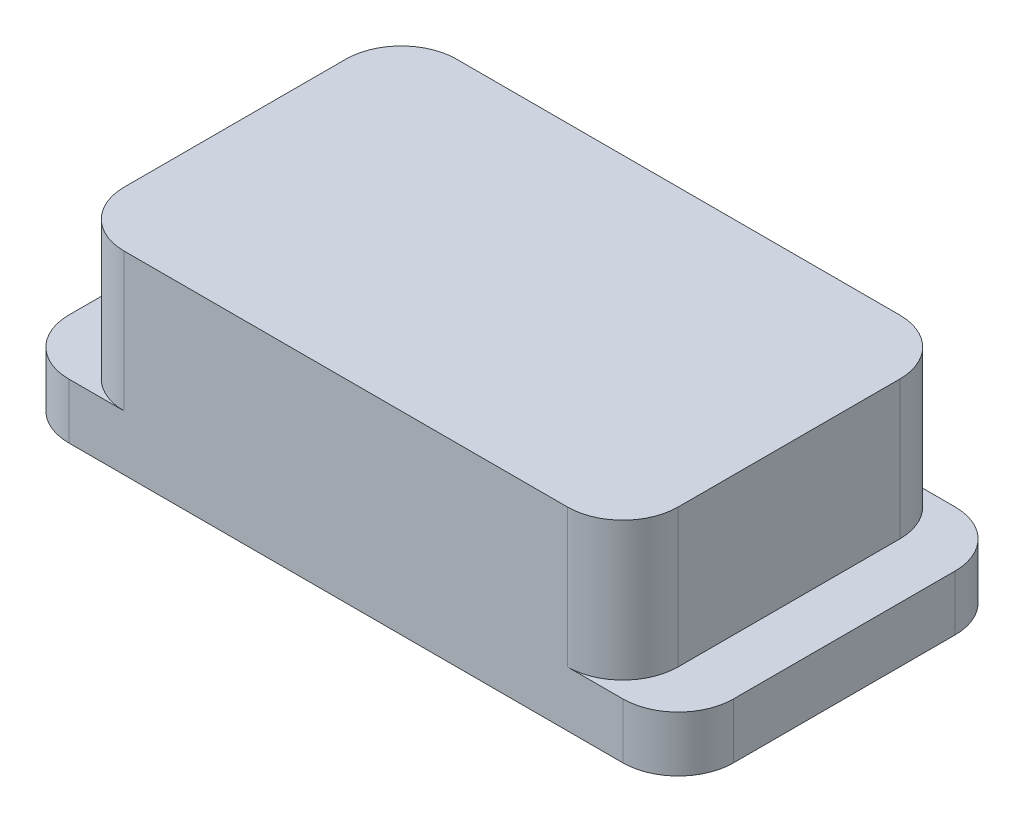
ISO-10303-21;
HEADER;
FILE_DESCRIPTION(('STEP AP214'),'2;1');
FILE_NAME('part.step','',(''),(''),'','','');
FILE_SCHEMA(('AUTOMOTIVE_DESIGN { 1 0 10303 214 1 1 1 1 }'));
ENDSEC;
DATA;
#1=APPLICATION_CONTEXT('core data for automotive mechanical design processes');
#2=APPLICATION_PROTOCOL_DEFINITION('international standard','automotive_design',2000,#1);
#3=PRODUCT_CONTEXT('',#1,'mechanical');
#4=PRODUCT('Part','Part','',(#3));
#5=PRODUCT_RELATED_PRODUCT_CATEGORY('part','',(#4));
#6=PRODUCT_DEFINITION_FORMATION('','',#4);
#7=PRODUCT_DEFINITION_CONTEXT('part definition',#1,'design');
#8=PRODUCT_DEFINITION('design','',#6,#7);
#9=PRODUCT_DEFINITION_SHAPE('','',#8);
#10=(LENGTH_UNIT() NAMED_UNIT(*) SI_UNIT(.MILLI.,.METRE.));
#11=(NAMED_UNIT(*) PLANE_ANGLE_UNIT() SI_UNIT($,.RADIAN.));
#12=(NAMED_UNIT(*) SI_UNIT($,.STERADIAN.) SOLID_ANGLE_UNIT());
#13=UNCERTAINTY_MEASURE_WITH_UNIT(LENGTH_MEASURE(1.E-05),#10,'distance_accuracy_value','');
#14=(GEOMETRIC_REPRESENTATION_CONTEXT(3) GLOBAL_UNCERTAINTY_ASSIGNED_CONTEXT((#13)) GLOBAL_UNIT_ASSIGNED_CONTEXT((#10,
#11,#12)) REPRESENTATION_CONTEXT('',''));
#15=CARTESIAN_POINT('',(0.,0.,0.));
#16=DIRECTION('',(0.,0.,1.));
#17=DIRECTION('',(1.,0.,0.));
#18=AXIS2_PLACEMENT_3D('',#15,#16,#17);
#19=CARTESIAN_POINT('',(5.,2.5,-3.));
#20=DIRECTION('',(-1.,0.,0.));
#21=DIRECTION('',(0.,0.,1.));
#22=AXIS2_PLACEMENT_3D('',#19,#20,#21);
#23=PLANE('',#22);
#24=DIRECTION('',(0.,0.,-1.));
#25=VECTOR('',#24,1.);
#26=CARTESIAN_POINT('',(5.,2.5,-3.));
#27=LINE('',#26,#25);
#28=CARTESIAN_POINT('',(5.,2.5,2.));
#29=VERTEX_POINT('',#28);
#30=CARTESIAN_POINT('',(5.,2.5,-2.));
#31=VERTEX_POINT('',#30);
#32=EDGE_CURVE('E296',#29,#31,#27,.T.);
#33=ORIENTED_EDGE('',*,*,#32,.F.);
#34=DIRECTION('',(0.,-1.,0.));
#35=VECTOR('',#34,1.);
#36=CARTESIAN_POINT('',(5.,2.5,2.));
#37=LINE('',#36,#35);
#38=CARTESIAN_POINT('',(5.,0.,2.));
#39=VERTEX_POINT('',#38);
#40=EDGE_CURVE('E193',#29,#39,#37,.T.);
#41=ORIENTED_EDGE('',*,*,#40,.T.);
#42=DIRECTION('',(0.,0.,-1.));
#43=VECTOR('',#42,1.);
#44=CARTESIAN_POINT('',(5.,0.,-3.));
#45=LINE('',#44,#43);
#46=CARTESIAN_POINT('',(5.,0.,-2.));
#47=VERTEX_POINT('',#46);
#48=EDGE_CURVE('E203',#39,#47,#45,.T.);
#49=ORIENTED_EDGE('',*,*,#48,.T.);
#50=DIRECTION('',(0.,-1.,0.));
#51=VECTOR('',#50,1.);
#52=CARTESIAN_POINT('',(5.,2.5,-2.));
#53=LINE('',#52,#51);
#54=EDGE_CURVE('E191',#47,#31,#53,.F.);
#55=ORIENTED_EDGE('',*,*,#54,.T.);
#56=EDGE_LOOP('',(#33,#41,#49,#55));
#57=FACE_BOUND('',#56,.T.);
#58=ADVANCED_FACE('F33',(#57),#23,.F.);
#59=CARTESIAN_POINT('',(-5.,2.5,-3.));
#60=DIRECTION('',(0.,0.,1.));
#61=DIRECTION('',(1.,0.,0.));
#62=AXIS2_PLACEMENT_3D('',#59,#60,#61);
#63=PLANE('',#62);
#64=DIRECTION('',(1.,0.,0.));
#65=VECTOR('',#64,1.);
#66=CARTESIAN_POINT('',(6.,-1.,-3.));
#67=LINE('',#66,#65);
#68=CARTESIAN_POINT('',(-5.,-1.,-3.));
#69=VERTEX_POINT('',#68);
#70=CARTESIAN_POINT('',(5.,-1.,-3.));
#71=VERTEX_POINT('',#70);
#72=EDGE_CURVE('E270',#69,#71,#67,.T.);
#73=ORIENTED_EDGE('',*,*,#72,.F.);
#74=DIRECTION('',(0.,1.,0.));
#75=VECTOR('',#74,1.);
#76=CARTESIAN_POINT('',(-5.,2.5,-3.));
#77=LINE('',#76,#75);
#78=CARTESIAN_POINT('',(-5.,0.,-3.));
#79=VERTEX_POINT('',#78);
#80=EDGE_CURVE('E159',#69,#79,#77,.T.);
#81=ORIENTED_EDGE('',*,*,#80,.T.);
#82=DIRECTION('',(1.,0.,0.));
#83=VECTOR('',#82,1.);
#84=CARTESIAN_POINT('',(6.,0.,-3.));
#85=LINE('',#84,#83);
#86=CARTESIAN_POINT('',(-4.,0.,-3.));
#87=VERTEX_POINT('',#86);
#88=EDGE_CURVE('E181',#79,#87,#85,.T.);
#89=ORIENTED_EDGE('',*,*,#88,.T.);
#90=DIRECTION('',(0.,-1.,0.));
#91=VECTOR('',#90,1.);
#92=CARTESIAN_POINT('',(-4.,2.5,-3.));
#93=LINE('',#92,#91);
#94=CARTESIAN_POINT('',(-4.,2.5,-3.));
#95=VERTEX_POINT('',#94);
#96=EDGE_CURVE('E179',#87,#95,#93,.F.);
#97=ORIENTED_EDGE('',*,*,#96,.T.);
#98=DIRECTION('',(-1.,0.,0.));
#99=VECTOR('',#98,1.);
#100=CARTESIAN_POINT('',(-5.,2.5,-3.));
#101=LINE('',#100,#99);
#102=CARTESIAN_POINT('',(4.,2.5,-3.));
#103=VERTEX_POINT('',#102);
#104=EDGE_CURVE('E254',#103,#95,#101,.T.);
#105=ORIENTED_EDGE('',*,*,#104,.F.);
#106=DIRECTION('',(0.,-1.,0.));
#107=VECTOR('',#106,1.);
#108=CARTESIAN_POINT('',(4.,2.5,-3.));
#109=LINE('',#108,#107);
#110=CARTESIAN_POINT('',(4.,0.,-3.));
#111=VERTEX_POINT('',#110);
#112=EDGE_CURVE('E168',#103,#111,#109,.T.);
#113=ORIENTED_EDGE('',*,*,#112,.T.);
#114=DIRECTION('',(1.,0.,0.));
#115=VECTOR('',#114,1.);
#116=CARTESIAN_POINT('',(6.,0.,-3.));
#117=LINE('',#116,#115);
#118=CARTESIAN_POINT('',(5.,0.,-3.));
#119=VERTEX_POINT('',#118);
#120=EDGE_CURVE('E151',#111,#119,#117,.T.);
#121=ORIENTED_EDGE('',*,*,#120,.T.);
#122=DIRECTION('',(0.,1.,0.));
#123=VECTOR('',#122,1.);
#124=CARTESIAN_POINT('',(5.,2.5,-3.));
#125=LINE('',#124,#123);
#126=EDGE_CURVE('E164',#119,#71,#125,.F.);
#127=ORIENTED_EDGE('',*,*,#126,.T.);
#128=EDGE_LOOP('',(#73,#81,#89,#97,#105,#113,#121,#127));
#129=FACE_BOUND('',#128,.T.);
#130=ADVANCED_FACE('F163',(#129),#63,.F.);
#131=CARTESIAN_POINT('',(-5.,2.5,-3.));
#132=DIRECTION('',(1.,0.,0.));
#133=DIRECTION('',(0.,0.,-1.));
#134=AXIS2_PLACEMENT_3D('',#131,#132,#133);
#135=PLANE('',#134);
#136=DIRECTION('',(0.,0.,1.));
#137=VECTOR('',#136,1.);
#138=CARTESIAN_POINT('',(-5.,0.,-3.));
#139=LINE('',#138,#137);
#140=CARTESIAN_POINT('',(-5.,0.,-2.));
#141=VERTEX_POINT('',#140);
#142=CARTESIAN_POINT('',(-5.,0.,2.));
#143=VERTEX_POINT('',#142);
#144=EDGE_CURVE('E269',#141,#143,#139,.T.);
#145=ORIENTED_EDGE('',*,*,#144,.T.);
#146=DIRECTION('',(0.,-1.,0.));
#147=VECTOR('',#146,1.);
#148=CARTESIAN_POINT('',(-5.,2.5,2.));
#149=LINE('',#148,#147);
#150=CARTESIAN_POINT('',(-5.,2.5,2.));
#151=VERTEX_POINT('',#150);
#152=EDGE_CURVE('E242',#143,#151,#149,.F.);
#153=ORIENTED_EDGE('',*,*,#152,.T.);
#154=DIRECTION('',(0.,0.,1.));
#155=VECTOR('',#154,1.);
#156=CARTESIAN_POINT('',(-5.,2.5,-3.));
#157=LINE('',#156,#155);
#158=CARTESIAN_POINT('',(-5.,2.5,-2.));
#159=VERTEX_POINT('',#158);
#160=EDGE_CURVE('E252',#159,#151,#157,.T.);
#161=ORIENTED_EDGE('',*,*,#160,.F.);
#162=DIRECTION('',(0.,-1.,0.));
#163=VECTOR('',#162,1.);
#164=CARTESIAN_POINT('',(-5.,2.5,-2.));
#165=LINE('',#164,#163);
#166=EDGE_CURVE('E239',#159,#141,#165,.T.);
#167=ORIENTED_EDGE('',*,*,#166,.T.);
#168=EDGE_LOOP('',(#145,#153,#161,#167));
#169=FACE_BOUND('',#168,.T.);
#170=ADVANCED_FACE('F260',(#169),#135,.F.);
#171=CARTESIAN_POINT('',(-5.,2.5,3.));
#172=DIRECTION('',(0.,0.,-1.));
#173=DIRECTION('',(-1.,0.,0.));
#174=AXIS2_PLACEMENT_3D('',#171,#172,#173);
#175=PLANE('',#174);
#176=DIRECTION('',(-1.,0.,0.));
#177=VECTOR('',#176,1.);
#178=CARTESIAN_POINT('',(6.,0.,3.));
#179=LINE('',#178,#177);
#180=CARTESIAN_POINT('',(-4.,0.,3.));
#181=VERTEX_POINT('',#180);
#182=CARTESIAN_POINT('',(-5.,0.,3.));
#183=VERTEX_POINT('',#182);
#184=EDGE_CURVE('E225',#181,#183,#179,.T.);
#185=ORIENTED_EDGE('',*,*,#184,.T.);
#186=DIRECTION('',(0.,1.,0.));
#187=VECTOR('',#186,1.);
#188=CARTESIAN_POINT('',(-5.,2.5,3.));
#189=LINE('',#188,#187);
#190=CARTESIAN_POINT('',(-5.,-1.,3.));
#191=VERTEX_POINT('',#190);
#192=EDGE_CURVE('E230',#183,#191,#189,.F.);
#193=ORIENTED_EDGE('',*,*,#192,.T.);
#194=DIRECTION('',(-1.,0.,0.));
#195=VECTOR('',#194,1.);
#196=CARTESIAN_POINT('',(6.,-1.,3.));
#197=LINE('',#196,#195);
#198=CARTESIAN_POINT('',(5.,-1.,3.));
#199=VERTEX_POINT('',#198);
#200=EDGE_CURVE('E292',#199,#191,#197,.T.);
#201=ORIENTED_EDGE('',*,*,#200,.F.);
#202=DIRECTION('',(0.,1.,0.));
#203=VECTOR('',#202,1.);
#204=CARTESIAN_POINT('',(5.,2.5,3.));
#205=LINE('',#204,#203);
#206=CARTESIAN_POINT('',(5.,0.,3.));
#207=VERTEX_POINT('',#206);
#208=EDGE_CURVE('E213',#199,#207,#205,.T.);
#209=ORIENTED_EDGE('',*,*,#208,.T.);
#210=DIRECTION('',(-1.,0.,0.));
#211=VECTOR('',#210,1.);
#212=CARTESIAN_POINT('',(6.,0.,3.));
#213=LINE('',#212,#211);
#214=CARTESIAN_POINT('',(4.,0.,3.));
#215=VERTEX_POINT('',#214);
#216=EDGE_CURVE('E200',#207,#215,#213,.T.);
#217=ORIENTED_EDGE('',*,*,#216,.T.);
#218=DIRECTION('',(0.,-1.,0.));
#219=VECTOR('',#218,1.);
#220=CARTESIAN_POINT('',(4.,2.5,3.));
#221=LINE('',#220,#219);
#222=CARTESIAN_POINT('',(4.,2.5,3.));
#223=VERTEX_POINT('',#222);
#224=EDGE_CURVE('E210',#215,#223,#221,.F.);
#225=ORIENTED_EDGE('',*,*,#224,.T.);
#226=DIRECTION('',(1.,0.,0.));
#227=VECTOR('',#226,1.);
#228=CARTESIAN_POINT('',(-5.,2.5,3.));
#229=LINE('',#228,#227);
#230=CARTESIAN_POINT('',(-4.,2.5,3.));
#231=VERTEX_POINT('',#230);
#232=EDGE_CURVE('E263',#231,#223,#229,.T.);
#233=ORIENTED_EDGE('',*,*,#232,.F.);
#234=DIRECTION('',(0.,-1.,0.));
#235=VECTOR('',#234,1.);
#236=CARTESIAN_POINT('',(-4.,2.5,3.));
#237=LINE('',#236,#235);
#238=EDGE_CURVE('E227',#231,#181,#237,.T.);
#239=ORIENTED_EDGE('',*,*,#238,.T.);
#240=EDGE_LOOP('',(#185,#193,#201,#209,#217,#225,#233,#239));
#241=FACE_BOUND('',#240,.T.);
#242=ADVANCED_FACE('F208',(#241),#175,.F.);
#243=CARTESIAN_POINT('',(0.,2.5,0.));
#244=DIRECTION('',(0.,1.,0.));
#245=DIRECTION('',(0.,0.,1.));
#246=AXIS2_PLACEMENT_3D('',#243,#244,#245);
#247=PLANE('',#246);
#248=ORIENTED_EDGE('',*,*,#160,.T.);
#249=CARTESIAN_POINT('',(-4.,2.5,2.));
#250=DIRECTION('',(0.,1.,0.));
#251=DIRECTION('',(0.,0.,1.));
#252=AXIS2_PLACEMENT_3D('',#249,#250,#251);
#253=CIRCLE('',#252,1.);
#254=EDGE_CURVE('E172',#151,#231,#253,.T.);
#255=ORIENTED_EDGE('',*,*,#254,.T.);
#256=ORIENTED_EDGE('',*,*,#232,.T.);
#257=CARTESIAN_POINT('',(4.,2.5,2.));
#258=DIRECTION('',(0.,1.,0.));
#259=DIRECTION('',(0.,0.,1.));
#260=AXIS2_PLACEMENT_3D('',#257,#258,#259);
#261=CIRCLE('',#260,1.);
#262=EDGE_CURVE('E217',#223,#29,#261,.T.);
#263=ORIENTED_EDGE('',*,*,#262,.T.);
#264=ORIENTED_EDGE('',*,*,#32,.T.);
#265=CARTESIAN_POINT('',(4.,2.5,-2.));
#266=DIRECTION('',(0.,1.,0.));
#267=DIRECTION('',(0.,0.,1.));
#268=AXIS2_PLACEMENT_3D('',#265,#266,#267);
#269=CIRCLE('',#268,1.);
#270=EDGE_CURVE('E244',#31,#103,#269,.T.);
#271=ORIENTED_EDGE('',*,*,#270,.T.);
#272=ORIENTED_EDGE('',*,*,#104,.T.);
#273=CARTESIAN_POINT('',(-4.,2.5,-2.));
#274=DIRECTION('',(0.,1.,0.));
#275=DIRECTION('',(0.,0.,1.));
#276=AXIS2_PLACEMENT_3D('',#273,#274,#275);
#277=CIRCLE('',#276,1.);
#278=EDGE_CURVE('E174',#95,#159,#277,.T.);
#279=ORIENTED_EDGE('',*,*,#278,.T.);
#280=EDGE_LOOP('',(#248,#255,#256,#263,#264,#271,#272,#279));
#281=FACE_BOUND('',#280,.T.);
#282=ADVANCED_FACE('F251',(#281),#247,.T.);
#283=CARTESIAN_POINT('',(0.,0.,0.));
#284=DIRECTION('',(0.,1.,0.));
#285=DIRECTION('',(0.,0.,1.));
#286=AXIS2_PLACEMENT_3D('',#283,#284,#285);
#287=PLANE('',#286);
#288=ORIENTED_EDGE('',*,*,#48,.F.);
#289=CARTESIAN_POINT('',(4.,0.,2.));
#290=DIRECTION('',(0.,1.,0.));
#291=DIRECTION('',(0.,0.,1.));
#292=AXIS2_PLACEMENT_3D('',#289,#290,#291);
#293=CIRCLE('',#292,1.);
#294=EDGE_CURVE('E41',#39,#215,#293,.F.);
#295=ORIENTED_EDGE('',*,*,#294,.T.);
#296=ORIENTED_EDGE('',*,*,#216,.F.);
#297=CARTESIAN_POINT('',(5.,0.,2.));
#298=DIRECTION('',(0.,1.,0.));
#299=DIRECTION('',(0.,0.,1.));
#300=AXIS2_PLACEMENT_3D('',#297,#298,#299);
#301=CIRCLE('',#300,1.);
#302=CARTESIAN_POINT('',(6.,0.,2.));
#303=VERTEX_POINT('',#302);
#304=EDGE_CURVE('E48',#207,#303,#301,.T.);
#305=ORIENTED_EDGE('',*,*,#304,.T.);
#306=DIRECTION('',(0.,0.,1.));
#307=VECTOR('',#306,1.);
#308=CARTESIAN_POINT('',(6.,0.,3.));
#309=LINE('',#308,#307);
#310=CARTESIAN_POINT('',(6.,0.,-2.));
#311=VERTEX_POINT('',#310);
#312=EDGE_CURVE('E154',#311,#303,#309,.T.);
#313=ORIENTED_EDGE('',*,*,#312,.F.);
#314=CARTESIAN_POINT('',(5.,0.,-2.));
#315=DIRECTION('',(0.,1.,0.));
#316=DIRECTION('',(0.,0.,1.));
#317=AXIS2_PLACEMENT_3D('',#314,#315,#316);
#318=CIRCLE('',#317,1.);
#319=EDGE_CURVE('E147',#311,#119,#318,.T.);
#320=ORIENTED_EDGE('',*,*,#319,.T.);
#321=ORIENTED_EDGE('',*,*,#120,.F.);
#322=CARTESIAN_POINT('',(4.,0.,-2.));
#323=DIRECTION('',(0.,1.,0.));
#324=DIRECTION('',(0.,0.,1.));
#325=AXIS2_PLACEMENT_3D('',#322,#323,#324);
#326=CIRCLE('',#325,1.);
#327=EDGE_CURVE('E11',#111,#47,#326,.F.);
#328=ORIENTED_EDGE('',*,*,#327,.T.);
#329=EDGE_LOOP('',(#288,#295,#296,#305,#313,#320,#321,#328));
#330=FACE_BOUND('',#329,.T.);
#331=ADVANCED_FACE('F150',(#330),#287,.T.);
#332=DIRECTION('',(0.,0.,-1.));
#333=VECTOR('',#332,1.);
#334=CARTESIAN_POINT('',(-6.,0.,3.));
#335=LINE('',#334,#333);
#336=CARTESIAN_POINT('',(-6.,0.,2.));
#337=VERTEX_POINT('',#336);
#338=CARTESIAN_POINT('',(-6.,0.,-2.));
#339=VERTEX_POINT('',#338);
#340=EDGE_CURVE('E287',#337,#339,#335,.T.);
#341=ORIENTED_EDGE('',*,*,#340,.F.);
#342=CARTESIAN_POINT('',(-5.,0.,2.));
#343=DIRECTION('',(0.,1.,0.));
#344=DIRECTION('',(0.,0.,1.));
#345=AXIS2_PLACEMENT_3D('',#342,#343,#344);
#346=CIRCLE('',#345,1.);
#347=EDGE_CURVE('E218',#337,#183,#346,.T.);
#348=ORIENTED_EDGE('',*,*,#347,.T.);
#349=ORIENTED_EDGE('',*,*,#184,.F.);
#350=CARTESIAN_POINT('',(-4.,0.,2.));
#351=DIRECTION('',(0.,1.,0.));
#352=DIRECTION('',(0.,0.,1.));
#353=AXIS2_PLACEMENT_3D('',#350,#351,#352);
#354=CIRCLE('',#353,1.);
#355=EDGE_CURVE('E196',#181,#143,#354,.F.);
#356=ORIENTED_EDGE('',*,*,#355,.T.);
#357=ORIENTED_EDGE('',*,*,#144,.F.);
#358=CARTESIAN_POINT('',(-4.,0.,-2.));
#359=DIRECTION('',(0.,1.,0.));
#360=DIRECTION('',(0.,0.,1.));
#361=AXIS2_PLACEMENT_3D('',#358,#359,#360);
#362=CIRCLE('',#361,1.);
#363=EDGE_CURVE('E198',#141,#87,#362,.F.);
#364=ORIENTED_EDGE('',*,*,#363,.T.);
#365=ORIENTED_EDGE('',*,*,#88,.F.);
#366=CARTESIAN_POINT('',(-5.,0.,-2.));
#367=DIRECTION('',(0.,1.,0.));
#368=DIRECTION('',(0.,0.,1.));
#369=AXIS2_PLACEMENT_3D('',#366,#367,#368);
#370=CIRCLE('',#369,1.);
#371=EDGE_CURVE('E56',#79,#339,#370,.T.);
#372=ORIENTED_EDGE('',*,*,#371,.T.);
#373=EDGE_LOOP('',(#341,#348,#349,#356,#357,#364,#365,#372));
#374=FACE_BOUND('',#373,.T.);
#375=ADVANCED_FACE('F268',(#374),#287,.T.);
#376=CARTESIAN_POINT('',(-6.,-1.,3.));
#377=DIRECTION('',(1.,0.,0.));
#378=DIRECTION('',(0.,0.,-1.));
#379=AXIS2_PLACEMENT_3D('',#376,#377,#378);
#380=PLANE('',#379);
#381=DIRECTION('',(0.,0.,-1.));
#382=VECTOR('',#381,1.);
#383=CARTESIAN_POINT('',(-6.,-1.,3.));
#384=LINE('',#383,#382);
#385=CARTESIAN_POINT('',(-6.,-1.,2.));
#386=VERTEX_POINT('',#385);
#387=CARTESIAN_POINT('',(-6.,-1.,-2.));
#388=VERTEX_POINT('',#387);
#389=EDGE_CURVE('E279',#386,#388,#384,.T.);
#390=ORIENTED_EDGE('',*,*,#389,.F.);
#391=DIRECTION('',(0.,1.,0.));
#392=VECTOR('',#391,1.);
#393=CARTESIAN_POINT('',(-6.,-1.,2.));
#394=LINE('',#393,#392);
#395=EDGE_CURVE('E304',#386,#337,#394,.T.);
#396=ORIENTED_EDGE('',*,*,#395,.T.);
#397=ORIENTED_EDGE('',*,*,#340,.T.);
#398=DIRECTION('',(0.,1.,0.));
#399=VECTOR('',#398,1.);
#400=CARTESIAN_POINT('',(-6.,-1.,-2.));
#401=LINE('',#400,#399);
#402=EDGE_CURVE('E273',#339,#388,#401,.F.);
#403=ORIENTED_EDGE('',*,*,#402,.T.);
#404=EDGE_LOOP('',(#390,#396,#397,#403));
#405=FACE_BOUND('',#404,.T.);
#406=ADVANCED_FACE('F305',(#405),#380,.F.);
#407=CARTESIAN_POINT('',(6.,-1.,3.));
#408=DIRECTION('',(-1.,0.,0.));
#409=DIRECTION('',(0.,0.,1.));
#410=AXIS2_PLACEMENT_3D('',#407,#408,#409);
#411=PLANE('',#410);
#412=ORIENTED_EDGE('',*,*,#312,.T.);
#413=DIRECTION('',(0.,1.,0.));
#414=VECTOR('',#413,1.);
#415=CARTESIAN_POINT('',(6.,-1.,2.));
#416=LINE('',#415,#414);
#417=CARTESIAN_POINT('',(6.,-1.,2.));
#418=VERTEX_POINT('',#417);
#419=EDGE_CURVE('E189',#303,#418,#416,.F.);
#420=ORIENTED_EDGE('',*,*,#419,.T.);
#421=DIRECTION('',(0.,0.,1.));
#422=VECTOR('',#421,1.);
#423=CARTESIAN_POINT('',(6.,-1.,3.));
#424=LINE('',#423,#422);
#425=CARTESIAN_POINT('',(6.,-1.,-2.));
#426=VERTEX_POINT('',#425);
#427=EDGE_CURVE('E285',#426,#418,#424,.T.);
#428=ORIENTED_EDGE('',*,*,#427,.F.);
#429=DIRECTION('',(0.,1.,0.));
#430=VECTOR('',#429,1.);
#431=CARTESIAN_POINT('',(6.,-1.,-2.));
#432=LINE('',#431,#430);
#433=EDGE_CURVE('E187',#426,#311,#432,.T.);
#434=ORIENTED_EDGE('',*,*,#433,.T.);
#435=EDGE_LOOP('',(#412,#420,#428,#434));
#436=FACE_BOUND('',#435,.T.);
#437=ADVANCED_FACE('F348',(#436),#411,.F.);
#438=CARTESIAN_POINT('',(0.,-1.,0.));
#439=DIRECTION('',(0.,1.,0.));
#440=DIRECTION('',(0.,0.,1.));
#441=AXIS2_PLACEMENT_3D('',#438,#439,#440);
#442=PLANE('',#441);
#443=ORIENTED_EDGE('',*,*,#200,.T.);
#444=CARTESIAN_POINT('',(-5.,-1.,2.));
#445=DIRECTION('',(0.,1.,0.));
#446=DIRECTION('',(0.,0.,1.));
#447=AXIS2_PLACEMENT_3D('',#444,#445,#446);
#448=CIRCLE('',#447,1.);
#449=EDGE_CURVE('E237',#191,#386,#448,.F.);
#450=ORIENTED_EDGE('',*,*,#449,.T.);
#451=ORIENTED_EDGE('',*,*,#389,.T.);
#452=CARTESIAN_POINT('',(-5.,-1.,-2.));
#453=DIRECTION('',(0.,1.,0.));
#454=DIRECTION('',(0.,0.,1.));
#455=AXIS2_PLACEMENT_3D('',#452,#453,#454);
#456=CIRCLE('',#455,1.);
#457=EDGE_CURVE('E235',#388,#69,#456,.F.);
#458=ORIENTED_EDGE('',*,*,#457,.T.);
#459=ORIENTED_EDGE('',*,*,#72,.T.);
#460=CARTESIAN_POINT('',(5.,-1.,-2.));
#461=DIRECTION('',(0.,1.,0.));
#462=DIRECTION('',(0.,0.,1.));
#463=AXIS2_PLACEMENT_3D('',#460,#461,#462);
#464=CIRCLE('',#463,1.);
#465=EDGE_CURVE('E171',#71,#426,#464,.F.);
#466=ORIENTED_EDGE('',*,*,#465,.T.);
#467=ORIENTED_EDGE('',*,*,#427,.T.);
#468=CARTESIAN_POINT('',(5.,-1.,2.));
#469=DIRECTION('',(0.,1.,0.));
#470=DIRECTION('',(0.,0.,1.));
#471=AXIS2_PLACEMENT_3D('',#468,#469,#470);
#472=CIRCLE('',#471,1.);
#473=EDGE_CURVE('E233',#418,#199,#472,.F.);
#474=ORIENTED_EDGE('',*,*,#473,.T.);
#475=EDGE_LOOP('',(#443,#450,#451,#458,#459,#466,#467,#474));
#476=FACE_BOUND('',#475,.T.);
#477=ADVANCED_FACE('F277',(#476),#442,.F.);
#478=CARTESIAN_POINT('',(-5.,-1.,2.));
#479=DIRECTION('',(0.,1.,0.));
#480=DIRECTION('',(0.,0.,1.));
#481=AXIS2_PLACEMENT_3D('',#478,#479,#480);
#482=CYLINDRICAL_SURFACE('',#481,1.);
#483=ORIENTED_EDGE('',*,*,#449,.F.);
#484=ORIENTED_EDGE('',*,*,#192,.F.);
#485=ORIENTED_EDGE('',*,*,#347,.F.);
#486=ORIENTED_EDGE('',*,*,#395,.F.);
#487=EDGE_LOOP('',(#483,#484,#485,#486));
#488=FACE_BOUND('',#487,.T.);
#489=ADVANCED_FACE('F307',(#488),#482,.T.);
#490=CARTESIAN_POINT('',(-4.,2.5,2.));
#491=DIRECTION('',(0.,-1.,0.));
#492=DIRECTION('',(0.,0.,-1.));
#493=AXIS2_PLACEMENT_3D('',#490,#491,#492);
#494=CYLINDRICAL_SURFACE('',#493,1.);
#495=ORIENTED_EDGE('',*,*,#254,.F.);
#496=ORIENTED_EDGE('',*,*,#152,.F.);
#497=ORIENTED_EDGE('',*,*,#355,.F.);
#498=ORIENTED_EDGE('',*,*,#238,.F.);
#499=EDGE_LOOP('',(#495,#496,#497,#498));
#500=FACE_BOUND('',#499,.T.);
#501=ADVANCED_FACE('F312',(#500),#494,.T.);
#502=CARTESIAN_POINT('',(-5.,2.5,-2.));
#503=DIRECTION('',(0.,1.,0.));
#504=DIRECTION('',(0.,0.,1.));
#505=AXIS2_PLACEMENT_3D('',#502,#503,#504);
#506=CYLINDRICAL_SURFACE('',#505,1.);
#507=ORIENTED_EDGE('',*,*,#457,.F.);
#508=ORIENTED_EDGE('',*,*,#402,.F.);
#509=ORIENTED_EDGE('',*,*,#371,.F.);
#510=ORIENTED_EDGE('',*,*,#80,.F.);
#511=EDGE_LOOP('',(#507,#508,#509,#510));
#512=FACE_BOUND('',#511,.T.);
#513=ADVANCED_FACE('F272',(#512),#506,.T.);
#514=CARTESIAN_POINT('',(-4.,2.5,-2.));
#515=DIRECTION('',(0.,-1.,0.));
#516=DIRECTION('',(0.,0.,-1.));
#517=AXIS2_PLACEMENT_3D('',#514,#515,#516);
#518=CYLINDRICAL_SURFACE('',#517,1.);
#519=ORIENTED_EDGE('',*,*,#278,.F.);
#520=ORIENTED_EDGE('',*,*,#96,.F.);
#521=ORIENTED_EDGE('',*,*,#363,.F.);
#522=ORIENTED_EDGE('',*,*,#166,.F.);
#523=EDGE_LOOP('',(#519,#520,#521,#522));
#524=FACE_BOUND('',#523,.T.);
#525=ADVANCED_FACE('F265',(#524),#518,.T.);
#526=CARTESIAN_POINT('',(5.,2.5,2.));
#527=DIRECTION('',(0.,1.,0.));
#528=DIRECTION('',(0.,0.,1.));
#529=AXIS2_PLACEMENT_3D('',#526,#527,#528);
#530=CYLINDRICAL_SURFACE('',#529,1.);
#531=ORIENTED_EDGE('',*,*,#473,.F.);
#532=ORIENTED_EDGE('',*,*,#419,.F.);
#533=ORIENTED_EDGE('',*,*,#304,.F.);
#534=ORIENTED_EDGE('',*,*,#208,.F.);
#535=EDGE_LOOP('',(#531,#532,#533,#534));
#536=FACE_BOUND('',#535,.T.);
#537=ADVANCED_FACE('F324',(#536),#530,.T.);
#538=CARTESIAN_POINT('',(4.,2.5,2.));
#539=DIRECTION('',(0.,-1.,0.));
#540=DIRECTION('',(0.,0.,-1.));
#541=AXIS2_PLACEMENT_3D('',#538,#539,#540);
#542=CYLINDRICAL_SURFACE('',#541,1.);
#543=ORIENTED_EDGE('',*,*,#262,.F.);
#544=ORIENTED_EDGE('',*,*,#224,.F.);
#545=ORIENTED_EDGE('',*,*,#294,.F.);
#546=ORIENTED_EDGE('',*,*,#40,.F.);
#547=EDGE_LOOP('',(#543,#544,#545,#546));
#548=FACE_BOUND('',#547,.T.);
#549=ADVANCED_FACE('F216',(#548),#542,.T.);
#550=CARTESIAN_POINT('',(4.,2.5,-2.));
#551=DIRECTION('',(0.,-1.,0.));
#552=DIRECTION('',(0.,0.,-1.));
#553=AXIS2_PLACEMENT_3D('',#550,#551,#552);
#554=CYLINDRICAL_SURFACE('',#553,1.);
#555=ORIENTED_EDGE('',*,*,#270,.F.);
#556=ORIENTED_EDGE('',*,*,#54,.F.);
#557=ORIENTED_EDGE('',*,*,#327,.F.);
#558=ORIENTED_EDGE('',*,*,#112,.F.);
#559=EDGE_LOOP('',(#555,#556,#557,#558));
#560=FACE_BOUND('',#559,.T.);
#561=ADVANCED_FACE('F318',(#560),#554,.T.);
#562=CARTESIAN_POINT('',(5.,-1.,-2.));
#563=DIRECTION('',(0.,1.,0.));
#564=DIRECTION('',(0.,0.,1.));
#565=AXIS2_PLACEMENT_3D('',#562,#563,#564);
#566=CYLINDRICAL_SURFACE('',#565,1.);
#567=ORIENTED_EDGE('',*,*,#465,.F.);
#568=ORIENTED_EDGE('',*,*,#126,.F.);
#569=ORIENTED_EDGE('',*,*,#319,.F.);
#570=ORIENTED_EDGE('',*,*,#433,.F.);
#571=EDGE_LOOP('',(#567,#568,#569,#570));
#572=FACE_BOUND('',#571,.T.);
#573=ADVANCED_FACE('F35',(#572),#566,.T.);
#574=CLOSED_SHELL('',(#58,#130,#170,#242,#282,#331,#375,#406,#437,#477,#489,#501,#513,#525,#537,
#549,#561,#573));
#575=MANIFOLD_SOLID_BREP('B2',#574);
#576=ADVANCED_BREP_SHAPE_REPRESENTATION('',(#18,#575),#14);
#577=SHAPE_DEFINITION_REPRESENTATION(#9,#576);
ENDSEC;
END-ISO-10303-21;
